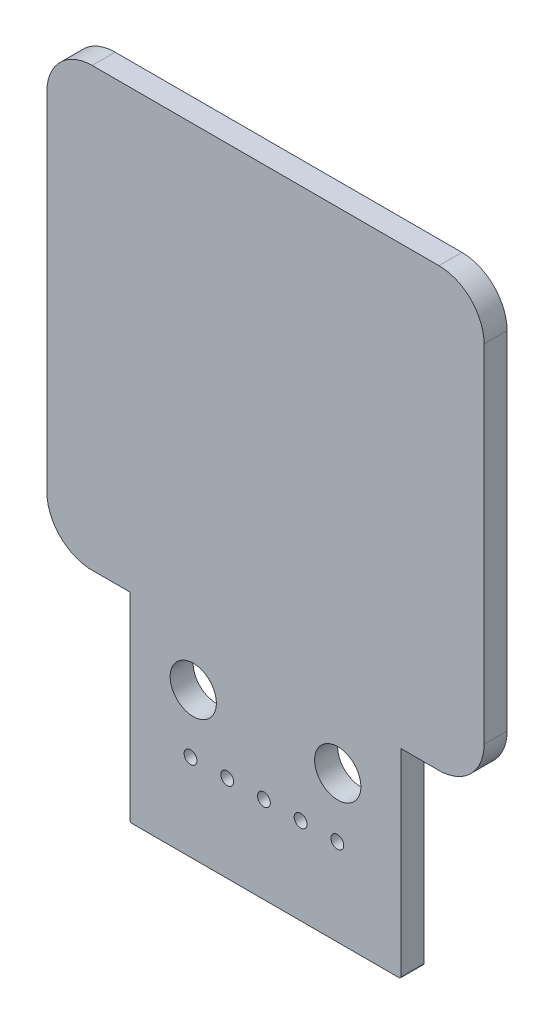
ISO-10303-21;
HEADER;
FILE_DESCRIPTION(('STEP AP214'),'2;1');
FILE_NAME('part.step','',(''),(''),'','','');
FILE_SCHEMA(('AUTOMOTIVE_DESIGN { 1 0 10303 214 1 1 1 1 }'));
ENDSEC;
DATA;
#1=APPLICATION_CONTEXT('core data for automotive mechanical design processes');
#2=APPLICATION_PROTOCOL_DEFINITION('international standard','automotive_design',2000,#1);
#3=PRODUCT_CONTEXT('',#1,'mechanical');
#4=PRODUCT('Part','Part','',(#3));
#5=PRODUCT_RELATED_PRODUCT_CATEGORY('part','',(#4));
#6=PRODUCT_DEFINITION_FORMATION('','',#4);
#7=PRODUCT_DEFINITION_CONTEXT('part definition',#1,'design');
#8=PRODUCT_DEFINITION('design','',#6,#7);
#9=PRODUCT_DEFINITION_SHAPE('','',#8);
#10=(LENGTH_UNIT() NAMED_UNIT(*) SI_UNIT(.MILLI.,.METRE.));
#11=(NAMED_UNIT(*) PLANE_ANGLE_UNIT() SI_UNIT($,.RADIAN.));
#12=(NAMED_UNIT(*) SI_UNIT($,.STERADIAN.) SOLID_ANGLE_UNIT());
#13=UNCERTAINTY_MEASURE_WITH_UNIT(LENGTH_MEASURE(1.E-05),#10,'distance_accuracy_value','');
#14=(GEOMETRIC_REPRESENTATION_CONTEXT(3) GLOBAL_UNCERTAINTY_ASSIGNED_CONTEXT((#13)) GLOBAL_UNIT_ASSIGNED_CONTEXT((#10,
#11,#12)) REPRESENTATION_CONTEXT('',''));
#15=CARTESIAN_POINT('',(0.,0.,0.));
#16=DIRECTION('',(0.,0.,1.));
#17=DIRECTION('',(1.,0.,0.));
#18=AXIS2_PLACEMENT_3D('',#15,#16,#17);
#19=CARTESIAN_POINT('',(28.438999176025,49.888000488281,1.59143954));
#20=DIRECTION('',(0.,0.,-1.));
#21=DIRECTION('',(0.,-1.,0.));
#22=AXIS2_PLACEMENT_3D('',#19,#20,#21);
#23=PLANE('',#22);
#24=CARTESIAN_POINT('',(45.74999994,46.19999904,1.59143954));
#25=DIRECTION('',(0.,0.,1.));
#26=DIRECTION('',(1.,0.,0.));
#27=AXIS2_PLACEMENT_3D('',#24,#25,#26);
#28=CIRCLE('',#27,1.59999934);
#29=CARTESIAN_POINT('',(47.34999928,46.19999904,1.59143954));
#30=VERTEX_POINT('',#29);
#31=EDGE_CURVE('E27',#30,#30,#28,.T.);
#32=ORIENTED_EDGE('',*,*,#31,.F.);
#33=EDGE_LOOP('',(#32));
#34=FACE_BOUND('',#33,.T.);
#35=CARTESIAN_POINT('',(45.72,42.07999966,1.59143954));
#36=DIRECTION('',(0.,0.,1.));
#37=DIRECTION('',(1.,0.,0.));
#38=AXIS2_PLACEMENT_3D('',#35,#36,#37);
#39=CIRCLE('',#38,0.4445);
#40=CARTESIAN_POINT('',(46.1645,42.07999966,1.59143954));
#41=VERTEX_POINT('',#40);
#42=EDGE_CURVE('E368',#41,#41,#39,.T.);
#43=ORIENTED_EDGE('',*,*,#42,.F.);
#44=EDGE_LOOP('',(#43));
#45=FACE_BOUND('',#44,.T.);
#46=CARTESIAN_POINT('',(43.18,42.07999966,1.59143954));
#47=DIRECTION('',(0.,0.,1.));
#48=DIRECTION('',(1.,0.,0.));
#49=AXIS2_PLACEMENT_3D('',#46,#47,#48);
#50=CIRCLE('',#49,0.4445);
#51=CARTESIAN_POINT('',(43.6245,42.07999966,1.59143954));
#52=VERTEX_POINT('',#51);
#53=EDGE_CURVE('E322',#52,#52,#50,.T.);
#54=ORIENTED_EDGE('',*,*,#53,.F.);
#55=EDGE_LOOP('',(#54));
#56=FACE_BOUND('',#55,.T.);
#57=CARTESIAN_POINT('',(40.64,42.07999966,1.59143954));
#58=DIRECTION('',(0.,0.,1.));
#59=DIRECTION('',(1.,0.,0.));
#60=AXIS2_PLACEMENT_3D('',#57,#58,#59);
#61=CIRCLE('',#60,0.4445);
#62=CARTESIAN_POINT('',(41.0845,42.07999966,1.59143954));
#63=VERTEX_POINT('',#62);
#64=EDGE_CURVE('E326',#63,#63,#61,.T.);
#65=ORIENTED_EDGE('',*,*,#64,.F.);
#66=EDGE_LOOP('',(#65));
#67=FACE_BOUND('',#66,.T.);
#68=CARTESIAN_POINT('',(35.74999962,46.19999904,1.59143954));
#69=DIRECTION('',(0.,0.,1.));
#70=DIRECTION('',(1.,0.,0.));
#71=AXIS2_PLACEMENT_3D('',#68,#69,#70);
#72=CIRCLE('',#71,1.59999934);
#73=CARTESIAN_POINT('',(37.34999896,46.19999904,1.59143954));
#74=VERTEX_POINT('',#73);
#75=EDGE_CURVE('E440',#74,#74,#72,.T.);
#76=ORIENTED_EDGE('',*,*,#75,.F.);
#77=EDGE_LOOP('',(#76));
#78=FACE_BOUND('',#77,.T.);
#79=CARTESIAN_POINT('',(35.56,42.07999966,1.59143954));
#80=DIRECTION('',(0.,0.,1.));
#81=DIRECTION('',(1.,0.,0.));
#82=AXIS2_PLACEMENT_3D('',#79,#80,#81);
#83=CIRCLE('',#82,0.4445);
#84=CARTESIAN_POINT('',(36.0045,42.07999966,1.59143954));
#85=VERTEX_POINT('',#84);
#86=EDGE_CURVE('E347',#85,#85,#83,.T.);
#87=ORIENTED_EDGE('',*,*,#86,.F.);
#88=EDGE_LOOP('',(#87));
#89=FACE_BOUND('',#88,.T.);
#90=CARTESIAN_POINT('',(38.1,42.07999966,1.59143954));
#91=DIRECTION('',(0.,0.,1.));
#92=DIRECTION('',(1.,0.,0.));
#93=AXIS2_PLACEMENT_3D('',#90,#91,#92);
#94=CIRCLE('',#93,0.4445);
#95=CARTESIAN_POINT('',(38.5445,42.07999966,1.59143954));
#96=VERTEX_POINT('',#95);
#97=EDGE_CURVE('E474',#96,#96,#94,.T.);
#98=ORIENTED_EDGE('',*,*,#97,.F.);
#99=EDGE_LOOP('',(#98));
#100=FACE_BOUND('',#99,.T.);
#101=CARTESIAN_POINT('',(28.502535775845,50.014855238936,1.59143954));
#102=DIRECTION('',(0.,0.,1.));
#103=DIRECTION('',(-0.447829373060854,-0.894119037166709,0.));
#104=AXIS2_PLACEMENT_3D('',#101,#102,#103);
#105=CIRCLE('',#104,0.141876803179);
#106=CARTESIAN_POINT('',(28.438999176025,49.888000488281,1.59143954));
#107=VERTEX_POINT('',#106);
#108=CARTESIAN_POINT('',(28.5,49.873001098633,1.59143954));
#109=VERTEX_POINT('',#108);
#110=EDGE_CURVE('E355',#107,#109,#105,.T.);
#111=ORIENTED_EDGE('',*,*,#110,.T.);
#112=DIRECTION('',(1.,0.,0.));
#113=VECTOR('',#112,1.);
#114=CARTESIAN_POINT('',(28.5,49.873001098633,1.59143954));
#115=LINE('',#114,#113);
#116=CARTESIAN_POINT('',(31.372999191284,49.873001098633,1.59143954));
#117=VERTEX_POINT('',#116);
#118=EDGE_CURVE('E283',#109,#117,#115,.T.);
#119=ORIENTED_EDGE('',*,*,#118,.T.);
#120=DIRECTION('',(0.,-1.,0.));
#121=VECTOR('',#120,1.);
#122=CARTESIAN_POINT('',(31.372999191284,49.873001098633,1.59143954));
#123=LINE('',#122,#121);
#124=CARTESIAN_POINT('',(31.372999191284,36.200000762939,1.59143954));
#125=VERTEX_POINT('',#124);
#126=EDGE_CURVE('E381',#117,#125,#123,.T.);
#127=ORIENTED_EDGE('',*,*,#126,.T.);
#128=CARTESIAN_POINT('',(31.499328380152,36.199331040368,1.59143954));
#129=DIRECTION('',(0.,0.,1.));
#130=DIRECTION('',(-0.999985947832841,0.00530133349769616,0.));
#131=AXIS2_PLACEMENT_3D('',#128,#129,#130);
#132=CIRCLE('',#131,0.126330964092);
#133=CARTESIAN_POINT('',(31.5,36.073001861572,1.59143954));
#134=VERTEX_POINT('',#133);
#135=EDGE_CURVE('E298',#125,#134,#132,.T.);
#136=ORIENTED_EDGE('',*,*,#135,.T.);
#137=DIRECTION('',(1.,0.,0.));
#138=VECTOR('',#137,1.);
#139=CARTESIAN_POINT('',(31.5,36.073001861572,1.59143954));
#140=LINE('',#139,#138);
#141=CARTESIAN_POINT('',(50.,36.073001861572,1.59143954));
#142=VERTEX_POINT('',#141);
#143=EDGE_CURVE('E458',#134,#142,#140,.T.);
#144=ORIENTED_EDGE('',*,*,#143,.T.);
#145=CARTESIAN_POINT('',(50.000672944282,36.199327818658,1.59143954));
#146=DIRECTION('',(0.,0.,1.));
#147=DIRECTION('',(-0.00532697118682877,-0.999985811588332,0.));
#148=AXIS2_PLACEMENT_3D('',#145,#146,#147);
#149=CIRCLE('',#148,0.126327749476);
#150=CARTESIAN_POINT('',(50.126998901367,36.200000762939,1.59143954));
#151=VERTEX_POINT('',#150);
#152=EDGE_CURVE('E296',#142,#151,#149,.T.);
#153=ORIENTED_EDGE('',*,*,#152,.T.);
#154=DIRECTION('',(0.,1.,0.));
#155=VECTOR('',#154,1.);
#156=CARTESIAN_POINT('',(50.126998901367,36.200000762939,1.59143954));
#157=LINE('',#156,#155);
#158=CARTESIAN_POINT('',(50.126998901367,49.873001098633,1.59143954));
#159=VERTEX_POINT('',#158);
#160=EDGE_CURVE('E364',#151,#159,#157,.T.);
#161=ORIENTED_EDGE('',*,*,#160,.T.);
#162=DIRECTION('',(1.,0.,0.));
#163=VECTOR('',#162,1.);
#164=CARTESIAN_POINT('',(50.126998901367,49.873001098633,1.59143954));
#165=LINE('',#164,#163);
#166=CARTESIAN_POINT('',(53.,49.873001098633,1.59143954));
#167=VERTEX_POINT('',#166);
#168=EDGE_CURVE('E258',#159,#167,#165,.T.);
#169=ORIENTED_EDGE('',*,*,#168,.T.);
#170=CARTESIAN_POINT('',(52.997459884636,50.014872887272,1.59143954));
#171=DIRECTION('',(0.,0.,1.));
#172=DIRECTION('',(0.017901433059204,-0.999839756508225,0.));
#173=AXIS2_PLACEMENT_3D('',#170,#171,#172);
#174=CIRCLE('',#173,0.141894526313);
#175=CARTESIAN_POINT('',(53.061000823975,49.888000488281,1.59143954));
#176=VERTEX_POINT('',#175);
#177=EDGE_CURVE('E255',#167,#176,#174,.T.);
#178=ORIENTED_EDGE('',*,*,#177,.T.);
#179=CARTESIAN_POINT('',(52.751520493602,52.998119575795,1.59143954));
#180=DIRECTION('',(0.,0.,1.));
#181=DIRECTION('',(0.0990185290008269,-0.99508558974317,0.));
#182=AXIS2_PLACEMENT_3D('',#179,#180,#181);
#183=CIRCLE('',#182,3.125478973438);
#184=CARTESIAN_POINT('',(55.876998901367,53.,1.59143954));
#185=VERTEX_POINT('',#184);
#186=EDGE_CURVE('E240',#176,#185,#183,.T.);
#187=ORIENTED_EDGE('',*,*,#186,.T.);
#188=DIRECTION('',(0.,1.,0.));
#189=VECTOR('',#188,1.);
#190=CARTESIAN_POINT('',(55.876998901367,53.,1.59143954));
#191=LINE('',#190,#189);
#192=CARTESIAN_POINT('',(55.876998901367,77.,1.59143954));
#193=VERTEX_POINT('',#192);
#194=EDGE_CURVE('E335',#185,#193,#191,.T.);
#195=ORIENTED_EDGE('',*,*,#194,.T.);
#196=CARTESIAN_POINT('',(52.749577959162,76.999577959162,1.59143954));
#197=DIRECTION('',(0.,0.,1.));
#198=DIRECTION('',(0.999999990894448,0.00013494852217636,0.));
#199=AXIS2_PLACEMENT_3D('',#196,#197,#198);
#200=CIRCLE('',#199,3.127420970682);
#201=CARTESIAN_POINT('',(52.75,80.126998901367,1.59143954));
#202=VERTEX_POINT('',#201);
#203=EDGE_CURVE('E340',#193,#202,#200,.T.);
#204=ORIENTED_EDGE('',*,*,#203,.T.);
#205=DIRECTION('',(-1.,0.,0.));
#206=VECTOR('',#205,1.);
#207=CARTESIAN_POINT('',(52.75,80.126998901367,1.59143954));
#208=LINE('',#207,#206);
#209=CARTESIAN_POINT('',(28.75,80.126998901367,1.59143954));
#210=VERTEX_POINT('',#209);
#211=EDGE_CURVE('E131',#202,#210,#208,.T.);
#212=ORIENTED_EDGE('',*,*,#211,.T.);
#213=CARTESIAN_POINT('',(28.750420133051,76.999577959343,1.59143954));
#214=DIRECTION('',(0.,0.,1.));
#215=DIRECTION('',(-0.000134338502895044,0.999999990976583,0.));
#216=AXIS2_PLACEMENT_3D('',#213,#214,#215);
#217=CIRCLE('',#216,3.127420970244);
#218=CARTESIAN_POINT('',(25.622999191284,77.,1.59143954));
#219=VERTEX_POINT('',#218);
#220=EDGE_CURVE('E308',#210,#219,#217,.T.);
#221=ORIENTED_EDGE('',*,*,#220,.T.);
#222=DIRECTION('',(0.,-1.,0.));
#223=VECTOR('',#222,1.);
#224=CARTESIAN_POINT('',(25.622999191284,77.,1.59143954));
#225=LINE('',#224,#223);
#226=CARTESIAN_POINT('',(25.622999191284,53.,1.59143954));
#227=VERTEX_POINT('',#226);
#228=EDGE_CURVE('E376',#219,#227,#225,.T.);
#229=ORIENTED_EDGE('',*,*,#228,.T.);
#230=CARTESIAN_POINT('',(28.748481284483,52.998123100366,1.59143954));
#231=DIRECTION('',(0.,0.,1.));
#232=DIRECTION('',(-0.999999819690771,0.000600515133193362,0.));
#233=AXIS2_PLACEMENT_3D('',#230,#231,#232);
#234=CIRCLE('',#233,3.125482656752);
#235=EDGE_CURVE('E284',#227,#107,#234,.T.);
#236=ORIENTED_EDGE('',*,*,#235,.T.);
#237=EDGE_LOOP('',(#111,#119,#127,#136,#144,#153,#161,#169,#178,#187,#195,#204,#212,#221,#229,#236));
#238=FACE_BOUND('',#237,.T.);
#239=ADVANCED_FACE('F16',(#34,#45,#56,#67,#78,#89,#100,#238),#23,.F.);
#240=CARTESIAN_POINT('',(28.438999176025,49.888000488281,0.));
#241=DIRECTION('',(0.,0.,-1.));
#242=DIRECTION('',(0.,-1.,0.));
#243=AXIS2_PLACEMENT_3D('',#240,#241,#242);
#244=PLANE('',#243);
#245=CARTESIAN_POINT('',(45.74999994,46.19999904,0.));
#246=DIRECTION('',(0.,0.,1.));
#247=DIRECTION('',(1.,0.,0.));
#248=AXIS2_PLACEMENT_3D('',#245,#246,#247);
#249=CIRCLE('',#248,1.59999934);
#250=CARTESIAN_POINT('',(47.34999928,46.19999904,0.));
#251=VERTEX_POINT('',#250);
#252=EDGE_CURVE('E11',#251,#251,#249,.T.);
#253=ORIENTED_EDGE('',*,*,#252,.T.);
#254=EDGE_LOOP('',(#253));
#255=FACE_BOUND('',#254,.T.);
#256=CARTESIAN_POINT('',(45.72,42.07999966,0.));
#257=DIRECTION('',(0.,0.,1.));
#258=DIRECTION('',(1.,0.,0.));
#259=AXIS2_PLACEMENT_3D('',#256,#257,#258);
#260=CIRCLE('',#259,0.4445);
#261=CARTESIAN_POINT('',(46.1645,42.07999966,0.));
#262=VERTEX_POINT('',#261);
#263=EDGE_CURVE('E427',#262,#262,#260,.T.);
#264=ORIENTED_EDGE('',*,*,#263,.T.);
#265=EDGE_LOOP('',(#264));
#266=FACE_BOUND('',#265,.T.);
#267=CARTESIAN_POINT('',(43.18,42.07999966,0.));
#268=DIRECTION('',(0.,0.,1.));
#269=DIRECTION('',(1.,0.,0.));
#270=AXIS2_PLACEMENT_3D('',#267,#268,#269);
#271=CIRCLE('',#270,0.4445);
#272=CARTESIAN_POINT('',(43.6245,42.07999966,0.));
#273=VERTEX_POINT('',#272);
#274=EDGE_CURVE('E318',#273,#273,#271,.T.);
#275=ORIENTED_EDGE('',*,*,#274,.T.);
#276=EDGE_LOOP('',(#275));
#277=FACE_BOUND('',#276,.T.);
#278=CARTESIAN_POINT('',(40.64,42.07999966,0.));
#279=DIRECTION('',(0.,0.,1.));
#280=DIRECTION('',(1.,0.,0.));
#281=AXIS2_PLACEMENT_3D('',#278,#279,#280);
#282=CIRCLE('',#281,0.4445);
#283=CARTESIAN_POINT('',(41.0845,42.07999966,0.));
#284=VERTEX_POINT('',#283);
#285=EDGE_CURVE('E437',#284,#284,#282,.T.);
#286=ORIENTED_EDGE('',*,*,#285,.T.);
#287=EDGE_LOOP('',(#286));
#288=FACE_BOUND('',#287,.T.);
#289=CARTESIAN_POINT('',(35.74999962,46.19999904,0.));
#290=DIRECTION('',(0.,0.,1.));
#291=DIRECTION('',(1.,0.,0.));
#292=AXIS2_PLACEMENT_3D('',#289,#290,#291);
#293=CIRCLE('',#292,1.59999934);
#294=CARTESIAN_POINT('',(37.34999896,46.19999904,0.));
#295=VERTEX_POINT('',#294);
#296=EDGE_CURVE('E327',#295,#295,#293,.T.);
#297=ORIENTED_EDGE('',*,*,#296,.T.);
#298=EDGE_LOOP('',(#297));
#299=FACE_BOUND('',#298,.T.);
#300=CARTESIAN_POINT('',(35.56,42.07999966,0.));
#301=DIRECTION('',(0.,0.,1.));
#302=DIRECTION('',(1.,0.,0.));
#303=AXIS2_PLACEMENT_3D('',#300,#301,#302);
#304=CIRCLE('',#303,0.4445);
#305=CARTESIAN_POINT('',(36.0045,42.07999966,0.));
#306=VERTEX_POINT('',#305);
#307=EDGE_CURVE('E350',#306,#306,#304,.T.);
#308=ORIENTED_EDGE('',*,*,#307,.T.);
#309=EDGE_LOOP('',(#308));
#310=FACE_BOUND('',#309,.T.);
#311=CARTESIAN_POINT('',(38.1,42.07999966,0.));
#312=DIRECTION('',(0.,0.,1.));
#313=DIRECTION('',(1.,0.,0.));
#314=AXIS2_PLACEMENT_3D('',#311,#312,#313);
#315=CIRCLE('',#314,0.4445);
#316=CARTESIAN_POINT('',(38.5445,42.07999966,0.));
#317=VERTEX_POINT('',#316);
#318=EDGE_CURVE('E477',#317,#317,#315,.T.);
#319=ORIENTED_EDGE('',*,*,#318,.T.);
#320=EDGE_LOOP('',(#319));
#321=FACE_BOUND('',#320,.T.);
#322=CARTESIAN_POINT('',(28.748481284483,52.998123100366,0.));
#323=DIRECTION('',(0.,0.,1.));
#324=DIRECTION('',(-0.999999819690771,0.000600515133193362,0.));
#325=AXIS2_PLACEMENT_3D('',#322,#323,#324);
#326=CIRCLE('',#325,3.125482656752);
#327=CARTESIAN_POINT('',(25.622999191284,53.,0.));
#328=VERTEX_POINT('',#327);
#329=CARTESIAN_POINT('',(28.438999176025,49.888000488281,0.));
#330=VERTEX_POINT('',#329);
#331=EDGE_CURVE('E190',#328,#330,#326,.T.);
#332=ORIENTED_EDGE('',*,*,#331,.F.);
#333=DIRECTION('',(0.,-1.,0.));
#334=VECTOR('',#333,1.);
#335=CARTESIAN_POINT('',(25.622999191284,77.,0.));
#336=LINE('',#335,#334);
#337=CARTESIAN_POINT('',(25.622999191284,77.,0.));
#338=VERTEX_POINT('',#337);
#339=EDGE_CURVE('E304',#338,#328,#336,.T.);
#340=ORIENTED_EDGE('',*,*,#339,.F.);
#341=CARTESIAN_POINT('',(28.750420133051,76.999577959343,0.));
#342=DIRECTION('',(0.,0.,1.));
#343=DIRECTION('',(-0.000134338502895044,0.999999990976583,0.));
#344=AXIS2_PLACEMENT_3D('',#341,#342,#343);
#345=CIRCLE('',#344,3.127420970244);
#346=CARTESIAN_POINT('',(28.75,80.126998901367,0.));
#347=VERTEX_POINT('',#346);
#348=EDGE_CURVE('E287',#347,#338,#345,.T.);
#349=ORIENTED_EDGE('',*,*,#348,.F.);
#350=DIRECTION('',(-1.,0.,0.));
#351=VECTOR('',#350,1.);
#352=CARTESIAN_POINT('',(52.75,80.126998901367,0.));
#353=LINE('',#352,#351);
#354=CARTESIAN_POINT('',(52.75,80.126998901367,0.));
#355=VERTEX_POINT('',#354);
#356=EDGE_CURVE('E146',#355,#347,#353,.T.);
#357=ORIENTED_EDGE('',*,*,#356,.F.);
#358=CARTESIAN_POINT('',(52.749577959162,76.999577959162,0.));
#359=DIRECTION('',(0.,0.,1.));
#360=DIRECTION('',(0.999999990894448,0.00013494852217636,0.));
#361=AXIS2_PLACEMENT_3D('',#358,#359,#360);
#362=CIRCLE('',#361,3.127420970682);
#363=CARTESIAN_POINT('',(55.876998901367,77.,0.));
#364=VERTEX_POINT('',#363);
#365=EDGE_CURVE('E446',#364,#355,#362,.T.);
#366=ORIENTED_EDGE('',*,*,#365,.F.);
#367=DIRECTION('',(0.,1.,0.));
#368=VECTOR('',#367,1.);
#369=CARTESIAN_POINT('',(55.876998901367,53.,0.));
#370=LINE('',#369,#368);
#371=CARTESIAN_POINT('',(55.876998901367,53.,0.));
#372=VERTEX_POINT('',#371);
#373=EDGE_CURVE('E252',#372,#364,#370,.T.);
#374=ORIENTED_EDGE('',*,*,#373,.F.);
#375=CARTESIAN_POINT('',(52.751520493602,52.998119575795,0.));
#376=DIRECTION('',(0.,0.,1.));
#377=DIRECTION('',(0.0990185290008269,-0.99508558974317,0.));
#378=AXIS2_PLACEMENT_3D('',#375,#376,#377);
#379=CIRCLE('',#378,3.125478973438);
#380=CARTESIAN_POINT('',(53.061000823975,49.888000488281,0.));
#381=VERTEX_POINT('',#380);
#382=EDGE_CURVE('E263',#381,#372,#379,.T.);
#383=ORIENTED_EDGE('',*,*,#382,.F.);
#384=CARTESIAN_POINT('',(52.997459884636,50.014872887272,0.));
#385=DIRECTION('',(0.,0.,1.));
#386=DIRECTION('',(0.017901433059204,-0.999839756508225,0.));
#387=AXIS2_PLACEMENT_3D('',#384,#385,#386);
#388=CIRCLE('',#387,0.141894526313);
#389=CARTESIAN_POINT('',(53.,49.873001098633,0.));
#390=VERTEX_POINT('',#389);
#391=EDGE_CURVE('E266',#390,#381,#388,.T.);
#392=ORIENTED_EDGE('',*,*,#391,.F.);
#393=DIRECTION('',(1.,0.,0.));
#394=VECTOR('',#393,1.);
#395=CARTESIAN_POINT('',(50.126998901367,49.873001098633,0.));
#396=LINE('',#395,#394);
#397=CARTESIAN_POINT('',(50.126998901367,49.873001098633,0.));
#398=VERTEX_POINT('',#397);
#399=EDGE_CURVE('E317',#398,#390,#396,.T.);
#400=ORIENTED_EDGE('',*,*,#399,.F.);
#401=DIRECTION('',(0.,1.,0.));
#402=VECTOR('',#401,1.);
#403=CARTESIAN_POINT('',(50.126998901367,36.200000762939,0.));
#404=LINE('',#403,#402);
#405=CARTESIAN_POINT('',(50.126998901367,36.200000762939,0.));
#406=VERTEX_POINT('',#405);
#407=EDGE_CURVE('E313',#406,#398,#404,.T.);
#408=ORIENTED_EDGE('',*,*,#407,.F.);
#409=CARTESIAN_POINT('',(50.000672944282,36.199327818658,0.));
#410=DIRECTION('',(0.,0.,1.));
#411=DIRECTION('',(-0.00532697118682877,-0.999985811588332,0.));
#412=AXIS2_PLACEMENT_3D('',#409,#410,#411);
#413=CIRCLE('',#412,0.126327749476);
#414=CARTESIAN_POINT('',(50.,36.073001861572,0.));
#415=VERTEX_POINT('',#414);
#416=EDGE_CURVE('E297',#415,#406,#413,.T.);
#417=ORIENTED_EDGE('',*,*,#416,.F.);
#418=DIRECTION('',(1.,0.,0.));
#419=VECTOR('',#418,1.);
#420=CARTESIAN_POINT('',(31.5,36.073001861572,0.));
#421=LINE('',#420,#419);
#422=CARTESIAN_POINT('',(31.5,36.073001861572,0.));
#423=VERTEX_POINT('',#422);
#424=EDGE_CURVE('E302',#423,#415,#421,.T.);
#425=ORIENTED_EDGE('',*,*,#424,.F.);
#426=CARTESIAN_POINT('',(31.499328380152,36.199331040368,0.));
#427=DIRECTION('',(0.,0.,1.));
#428=DIRECTION('',(-0.999985947832841,0.00530133349769616,0.));
#429=AXIS2_PLACEMENT_3D('',#426,#427,#428);
#430=CIRCLE('',#429,0.126330964092);
#431=CARTESIAN_POINT('',(31.372999191284,36.200000762939,0.));
#432=VERTEX_POINT('',#431);
#433=EDGE_CURVE('E378',#432,#423,#430,.T.);
#434=ORIENTED_EDGE('',*,*,#433,.F.);
#435=DIRECTION('',(0.,-1.,0.));
#436=VECTOR('',#435,1.);
#437=CARTESIAN_POINT('',(31.372999191284,49.873001098633,0.));
#438=LINE('',#437,#436);
#439=CARTESIAN_POINT('',(31.372999191284,49.873001098633,0.));
#440=VERTEX_POINT('',#439);
#441=EDGE_CURVE('E278',#440,#432,#438,.T.);
#442=ORIENTED_EDGE('',*,*,#441,.F.);
#443=DIRECTION('',(1.,0.,0.));
#444=VECTOR('',#443,1.);
#445=CARTESIAN_POINT('',(28.5,49.873001098633,0.));
#446=LINE('',#445,#444);
#447=CARTESIAN_POINT('',(28.5,49.873001098633,0.));
#448=VERTEX_POINT('',#447);
#449=EDGE_CURVE('E179',#448,#440,#446,.T.);
#450=ORIENTED_EDGE('',*,*,#449,.F.);
#451=CARTESIAN_POINT('',(28.502535775845,50.014855238936,0.));
#452=DIRECTION('',(0.,0.,1.));
#453=DIRECTION('',(-0.447829373060854,-0.894119037166709,0.));
#454=AXIS2_PLACEMENT_3D('',#451,#452,#453);
#455=CIRCLE('',#454,0.141876803179);
#456=EDGE_CURVE('E356',#330,#448,#455,.T.);
#457=ORIENTED_EDGE('',*,*,#456,.F.);
#458=EDGE_LOOP('',(#332,#340,#349,#357,#366,#374,#383,#392,#400,#408,#417,#425,#434,#442,#450,#457));
#459=FACE_BOUND('',#458,.T.);
#460=ADVANCED_FACE('F18',(#255,#266,#277,#288,#299,#310,#321,#459),#244,.T.);
#461=CARTESIAN_POINT('',(45.74999994,46.19999904,0.));
#462=DIRECTION('',(0.,0.,-1.));
#463=DIRECTION('',(1.,0.,0.));
#464=AXIS2_PLACEMENT_3D('',#461,#462,#463);
#465=CYLINDRICAL_SURFACE('',#464,1.59999934);
#466=DIRECTION('',(0.,0.,1.));
#467=VECTOR('',#466,1.);
#468=CARTESIAN_POINT('',(47.34999928,46.19999904,0.));
#469=LINE('',#468,#467);
#470=EDGE_CURVE('E418',#251,#30,#469,.T.);
#471=ORIENTED_EDGE('',*,*,#470,.T.);
#472=ORIENTED_EDGE('',*,*,#31,.T.);
#473=ORIENTED_EDGE('',*,*,#470,.F.);
#474=ORIENTED_EDGE('',*,*,#252,.F.);
#475=EDGE_LOOP('',(#471,#472,#473,#474));
#476=FACE_BOUND('',#475,.T.);
#477=ADVANCED_FACE('F497',(#476),#465,.F.);
#478=CARTESIAN_POINT('',(45.72,42.07999966,0.));
#479=DIRECTION('',(0.,0.,-1.));
#480=DIRECTION('',(1.,0.,0.));
#481=AXIS2_PLACEMENT_3D('',#478,#479,#480);
#482=CYLINDRICAL_SURFACE('',#481,0.4445);
#483=DIRECTION('',(0.,0.,1.));
#484=VECTOR('',#483,1.);
#485=CARTESIAN_POINT('',(46.1645,42.07999966,0.));
#486=LINE('',#485,#484);
#487=EDGE_CURVE('E321',#262,#41,#486,.T.);
#488=ORIENTED_EDGE('',*,*,#487,.T.);
#489=ORIENTED_EDGE('',*,*,#42,.T.);
#490=ORIENTED_EDGE('',*,*,#487,.F.);
#491=ORIENTED_EDGE('',*,*,#263,.F.);
#492=EDGE_LOOP('',(#488,#489,#490,#491));
#493=FACE_BOUND('',#492,.T.);
#494=ADVANCED_FACE('F762',(#493),#482,.F.);
#495=CARTESIAN_POINT('',(43.18,42.07999966,0.));
#496=DIRECTION('',(0.,0.,-1.));
#497=DIRECTION('',(1.,0.,0.));
#498=AXIS2_PLACEMENT_3D('',#495,#496,#497);
#499=CYLINDRICAL_SURFACE('',#498,0.4445);
#500=DIRECTION('',(0.,0.,1.));
#501=VECTOR('',#500,1.);
#502=CARTESIAN_POINT('',(43.6245,42.07999966,0.));
#503=LINE('',#502,#501);
#504=EDGE_CURVE('E433',#273,#52,#503,.T.);
#505=ORIENTED_EDGE('',*,*,#504,.T.);
#506=ORIENTED_EDGE('',*,*,#53,.T.);
#507=ORIENTED_EDGE('',*,*,#504,.F.);
#508=ORIENTED_EDGE('',*,*,#274,.F.);
#509=EDGE_LOOP('',(#505,#506,#507,#508));
#510=FACE_BOUND('',#509,.T.);
#511=ADVANCED_FACE('F651',(#510),#499,.F.);
#512=CARTESIAN_POINT('',(40.64,42.07999966,0.));
#513=DIRECTION('',(0.,0.,-1.));
#514=DIRECTION('',(1.,0.,0.));
#515=AXIS2_PLACEMENT_3D('',#512,#513,#514);
#516=CYLINDRICAL_SURFACE('',#515,0.4445);
#517=DIRECTION('',(0.,0.,1.));
#518=VECTOR('',#517,1.);
#519=CARTESIAN_POINT('',(41.0845,42.07999966,0.));
#520=LINE('',#519,#518);
#521=EDGE_CURVE('E323',#284,#63,#520,.T.);
#522=ORIENTED_EDGE('',*,*,#521,.T.);
#523=ORIENTED_EDGE('',*,*,#64,.T.);
#524=ORIENTED_EDGE('',*,*,#521,.F.);
#525=ORIENTED_EDGE('',*,*,#285,.F.);
#526=EDGE_LOOP('',(#522,#523,#524,#525));
#527=FACE_BOUND('',#526,.T.);
#528=ADVANCED_FACE('F641',(#527),#516,.F.);
#529=CARTESIAN_POINT('',(35.74999962,46.19999904,0.));
#530=DIRECTION('',(0.,0.,-1.));
#531=DIRECTION('',(1.,0.,0.));
#532=AXIS2_PLACEMENT_3D('',#529,#530,#531);
#533=CYLINDRICAL_SURFACE('',#532,1.59999934);
#534=DIRECTION('',(0.,0.,1.));
#535=VECTOR('',#534,1.);
#536=CARTESIAN_POINT('',(37.34999896,46.19999904,0.));
#537=LINE('',#536,#535);
#538=EDGE_CURVE('E444',#295,#74,#537,.T.);
#539=ORIENTED_EDGE('',*,*,#538,.T.);
#540=ORIENTED_EDGE('',*,*,#75,.T.);
#541=ORIENTED_EDGE('',*,*,#538,.F.);
#542=ORIENTED_EDGE('',*,*,#296,.F.);
#543=EDGE_LOOP('',(#539,#540,#541,#542));
#544=FACE_BOUND('',#543,.T.);
#545=ADVANCED_FACE('F636',(#544),#533,.F.);
#546=CARTESIAN_POINT('',(35.56,42.07999966,0.));
#547=DIRECTION('',(0.,0.,-1.));
#548=DIRECTION('',(1.,0.,0.));
#549=AXIS2_PLACEMENT_3D('',#546,#547,#548);
#550=CYLINDRICAL_SURFACE('',#549,0.4445);
#551=DIRECTION('',(0.,0.,1.));
#552=VECTOR('',#551,1.);
#553=CARTESIAN_POINT('',(36.0045,42.07999966,0.));
#554=LINE('',#553,#552);
#555=EDGE_CURVE('E20',#306,#85,#554,.T.);
#556=ORIENTED_EDGE('',*,*,#555,.T.);
#557=ORIENTED_EDGE('',*,*,#86,.T.);
#558=ORIENTED_EDGE('',*,*,#555,.F.);
#559=ORIENTED_EDGE('',*,*,#307,.F.);
#560=EDGE_LOOP('',(#556,#557,#558,#559));
#561=FACE_BOUND('',#560,.T.);
#562=ADVANCED_FACE('F493',(#561),#550,.F.);
#563=CARTESIAN_POINT('',(38.1,42.07999966,0.));
#564=DIRECTION('',(0.,0.,-1.));
#565=DIRECTION('',(1.,0.,0.));
#566=AXIS2_PLACEMENT_3D('',#563,#564,#565);
#567=CYLINDRICAL_SURFACE('',#566,0.4445);
#568=DIRECTION('',(0.,0.,1.));
#569=VECTOR('',#568,1.);
#570=CARTESIAN_POINT('',(38.5445,42.07999966,0.));
#571=LINE('',#570,#569);
#572=EDGE_CURVE('E276',#317,#96,#571,.T.);
#573=ORIENTED_EDGE('',*,*,#572,.T.);
#574=ORIENTED_EDGE('',*,*,#97,.T.);
#575=ORIENTED_EDGE('',*,*,#572,.F.);
#576=ORIENTED_EDGE('',*,*,#318,.F.);
#577=EDGE_LOOP('',(#573,#574,#575,#576));
#578=FACE_BOUND('',#577,.T.);
#579=ADVANCED_FACE('F715',(#578),#567,.F.);
#580=CARTESIAN_POINT('',(28.748481284483,52.998123100366,0.));
#581=DIRECTION('',(0.,0.,-1.));
#582=DIRECTION('',(-0.999999819690771,0.000600515133193362,0.));
#583=AXIS2_PLACEMENT_3D('',#580,#581,#582);
#584=CYLINDRICAL_SURFACE('',#583,3.125482656752);
#585=ORIENTED_EDGE('',*,*,#331,.T.);
#586=DIRECTION('',(0.,0.,1.));
#587=VECTOR('',#586,1.);
#588=CARTESIAN_POINT('',(28.438999176025,49.888000488281,0.));
#589=LINE('',#588,#587);
#590=EDGE_CURVE('E400',#330,#107,#589,.T.);
#591=ORIENTED_EDGE('',*,*,#590,.T.);
#592=ORIENTED_EDGE('',*,*,#235,.F.);
#593=DIRECTION('',(0.,0.,1.));
#594=VECTOR('',#593,1.);
#595=CARTESIAN_POINT('',(25.622999191284,53.,0.));
#596=LINE('',#595,#594);
#597=EDGE_CURVE('E307',#328,#227,#596,.T.);
#598=ORIENTED_EDGE('',*,*,#597,.F.);
#599=EDGE_LOOP('',(#585,#591,#592,#598));
#600=FACE_BOUND('',#599,.T.);
#601=ADVANCED_FACE('F500',(#600),#584,.T.);
#602=CARTESIAN_POINT('',(25.622999191284,77.,0.));
#603=DIRECTION('',(1.,0.,0.));
#604=DIRECTION('',(0.,1.,0.));
#605=AXIS2_PLACEMENT_3D('',#602,#603,#604);
#606=PLANE('',#605);
#607=ORIENTED_EDGE('',*,*,#339,.T.);
#608=ORIENTED_EDGE('',*,*,#597,.T.);
#609=ORIENTED_EDGE('',*,*,#228,.F.);
#610=DIRECTION('',(0.,0.,1.));
#611=VECTOR('',#610,1.);
#612=CARTESIAN_POINT('',(25.622999191284,77.,0.));
#613=LINE('',#612,#611);
#614=EDGE_CURVE('E291',#338,#219,#613,.T.);
#615=ORIENTED_EDGE('',*,*,#614,.F.);
#616=EDGE_LOOP('',(#607,#608,#609,#615));
#617=FACE_BOUND('',#616,.T.);
#618=ADVANCED_FACE('F503',(#617),#606,.F.);
#619=CARTESIAN_POINT('',(28.750420133051,76.999577959343,0.));
#620=DIRECTION('',(0.,0.,-1.));
#621=DIRECTION('',(-0.000134338502895044,0.999999990976583,0.));
#622=AXIS2_PLACEMENT_3D('',#619,#620,#621);
#623=CYLINDRICAL_SURFACE('',#622,3.127420970244);
#624=ORIENTED_EDGE('',*,*,#348,.T.);
#625=ORIENTED_EDGE('',*,*,#614,.T.);
#626=ORIENTED_EDGE('',*,*,#220,.F.);
#627=DIRECTION('',(0.,0.,1.));
#628=VECTOR('',#627,1.);
#629=CARTESIAN_POINT('',(28.75,80.126998901367,0.));
#630=LINE('',#629,#628);
#631=EDGE_CURVE('E359',#347,#210,#630,.T.);
#632=ORIENTED_EDGE('',*,*,#631,.F.);
#633=EDGE_LOOP('',(#624,#625,#626,#632));
#634=FACE_BOUND('',#633,.T.);
#635=ADVANCED_FACE('F509',(#634),#623,.T.);
#636=CARTESIAN_POINT('',(52.75,80.126998901367,0.));
#637=DIRECTION('',(0.,-1.,0.));
#638=DIRECTION('',(0.,0.,-1.));
#639=AXIS2_PLACEMENT_3D('',#636,#637,#638);
#640=PLANE('',#639);
#641=ORIENTED_EDGE('',*,*,#356,.T.);
#642=ORIENTED_EDGE('',*,*,#631,.T.);
#643=ORIENTED_EDGE('',*,*,#211,.F.);
#644=DIRECTION('',(0.,0.,1.));
#645=VECTOR('',#644,1.);
#646=CARTESIAN_POINT('',(52.75,80.126998901367,0.));
#647=LINE('',#646,#645);
#648=EDGE_CURVE('E343',#355,#202,#647,.T.);
#649=ORIENTED_EDGE('',*,*,#648,.F.);
#650=EDGE_LOOP('',(#641,#642,#643,#649));
#651=FACE_BOUND('',#650,.T.);
#652=ADVANCED_FACE('F511',(#651),#640,.F.);
#653=CARTESIAN_POINT('',(52.749577959162,76.999577959162,0.));
#654=DIRECTION('',(0.,0.,-1.));
#655=DIRECTION('',(0.999999990894448,0.00013494852217636,0.));
#656=AXIS2_PLACEMENT_3D('',#653,#654,#655);
#657=CYLINDRICAL_SURFACE('',#656,3.127420970682);
#658=ORIENTED_EDGE('',*,*,#365,.T.);
#659=ORIENTED_EDGE('',*,*,#648,.T.);
#660=ORIENTED_EDGE('',*,*,#203,.F.);
#661=DIRECTION('',(0.,0.,1.));
#662=VECTOR('',#661,1.);
#663=CARTESIAN_POINT('',(55.876998901367,77.,0.));
#664=LINE('',#663,#662);
#665=EDGE_CURVE('E331',#364,#193,#664,.T.);
#666=ORIENTED_EDGE('',*,*,#665,.F.);
#667=EDGE_LOOP('',(#658,#659,#660,#666));
#668=FACE_BOUND('',#667,.T.);
#669=ADVANCED_FACE('F629',(#668),#657,.T.);
#670=CARTESIAN_POINT('',(55.876998901367,53.,0.));
#671=DIRECTION('',(-1.,0.,0.));
#672=DIRECTION('',(0.,0.,1.));
#673=AXIS2_PLACEMENT_3D('',#670,#671,#672);
#674=PLANE('',#673);
#675=ORIENTED_EDGE('',*,*,#373,.T.);
#676=ORIENTED_EDGE('',*,*,#665,.T.);
#677=ORIENTED_EDGE('',*,*,#194,.F.);
#678=DIRECTION('',(0.,0.,1.));
#679=VECTOR('',#678,1.);
#680=CARTESIAN_POINT('',(55.876998901367,53.,0.));
#681=LINE('',#680,#679);
#682=EDGE_CURVE('E248',#372,#185,#681,.T.);
#683=ORIENTED_EDGE('',*,*,#682,.F.);
#684=EDGE_LOOP('',(#675,#676,#677,#683));
#685=FACE_BOUND('',#684,.T.);
#686=ADVANCED_FACE('F624',(#685),#674,.F.);
#687=CARTESIAN_POINT('',(52.751520493602,52.998119575795,0.));
#688=DIRECTION('',(0.,0.,-1.));
#689=DIRECTION('',(0.0990185290008269,-0.99508558974317,0.));
#690=AXIS2_PLACEMENT_3D('',#687,#688,#689);
#691=CYLINDRICAL_SURFACE('',#690,3.125478973438);
#692=ORIENTED_EDGE('',*,*,#382,.T.);
#693=ORIENTED_EDGE('',*,*,#682,.T.);
#694=ORIENTED_EDGE('',*,*,#186,.F.);
#695=DIRECTION('',(0.,0.,1.));
#696=VECTOR('',#695,1.);
#697=CARTESIAN_POINT('',(53.061000823975,49.888000488281,0.));
#698=LINE('',#697,#696);
#699=EDGE_CURVE('E245',#381,#176,#698,.T.);
#700=ORIENTED_EDGE('',*,*,#699,.F.);
#701=EDGE_LOOP('',(#692,#693,#694,#700));
#702=FACE_BOUND('',#701,.T.);
#703=ADVANCED_FACE('F243',(#702),#691,.T.);
#704=CARTESIAN_POINT('',(52.997459884636,50.014872887272,0.));
#705=DIRECTION('',(0.,0.,-1.));
#706=DIRECTION('',(0.017901433059204,-0.999839756508225,0.));
#707=AXIS2_PLACEMENT_3D('',#704,#705,#706);
#708=CYLINDRICAL_SURFACE('',#707,0.141894526313);
#709=ORIENTED_EDGE('',*,*,#391,.T.);
#710=ORIENTED_EDGE('',*,*,#699,.T.);
#711=ORIENTED_EDGE('',*,*,#177,.F.);
#712=DIRECTION('',(0.,0.,1.));
#713=VECTOR('',#712,1.);
#714=CARTESIAN_POINT('',(53.,49.873001098633,0.));
#715=LINE('',#714,#713);
#716=EDGE_CURVE('E314',#390,#167,#715,.T.);
#717=ORIENTED_EDGE('',*,*,#716,.F.);
#718=EDGE_LOOP('',(#709,#710,#711,#717));
#719=FACE_BOUND('',#718,.T.);
#720=ADVANCED_FACE('F265',(#719),#708,.T.);
#721=CARTESIAN_POINT('',(50.126998901367,49.873001098633,0.));
#722=DIRECTION('',(0.,1.,0.));
#723=DIRECTION('',(1.,0.,0.));
#724=AXIS2_PLACEMENT_3D('',#721,#722,#723);
#725=PLANE('',#724);
#726=ORIENTED_EDGE('',*,*,#399,.T.);
#727=ORIENTED_EDGE('',*,*,#716,.T.);
#728=ORIENTED_EDGE('',*,*,#168,.F.);
#729=DIRECTION('',(0.,0.,1.));
#730=VECTOR('',#729,1.);
#731=CARTESIAN_POINT('',(50.126998901367,49.873001098633,0.));
#732=LINE('',#731,#730);
#733=EDGE_CURVE('E360',#398,#159,#732,.T.);
#734=ORIENTED_EDGE('',*,*,#733,.F.);
#735=EDGE_LOOP('',(#726,#727,#728,#734));
#736=FACE_BOUND('',#735,.T.);
#737=ADVANCED_FACE('F675',(#736),#725,.F.);
#738=CARTESIAN_POINT('',(50.126998901367,36.200000762939,0.));
#739=DIRECTION('',(-1.,0.,0.));
#740=DIRECTION('',(0.,0.,1.));
#741=AXIS2_PLACEMENT_3D('',#738,#739,#740);
#742=PLANE('',#741);
#743=ORIENTED_EDGE('',*,*,#407,.T.);
#744=ORIENTED_EDGE('',*,*,#733,.T.);
#745=ORIENTED_EDGE('',*,*,#160,.F.);
#746=DIRECTION('',(0.,0.,1.));
#747=VECTOR('',#746,1.);
#748=CARTESIAN_POINT('',(50.126998901367,36.200000762939,0.));
#749=LINE('',#748,#747);
#750=EDGE_CURVE('E292',#406,#151,#749,.T.);
#751=ORIENTED_EDGE('',*,*,#750,.F.);
#752=EDGE_LOOP('',(#743,#744,#745,#751));
#753=FACE_BOUND('',#752,.T.);
#754=ADVANCED_FACE('F669',(#753),#742,.F.);
#755=CARTESIAN_POINT('',(50.000672944282,36.199327818658,0.));
#756=DIRECTION('',(0.,0.,-1.));
#757=DIRECTION('',(-0.00532697118682877,-0.999985811588332,0.));
#758=AXIS2_PLACEMENT_3D('',#755,#756,#757);
#759=CYLINDRICAL_SURFACE('',#758,0.126327749476);
#760=ORIENTED_EDGE('',*,*,#416,.T.);
#761=ORIENTED_EDGE('',*,*,#750,.T.);
#762=ORIENTED_EDGE('',*,*,#152,.F.);
#763=DIRECTION('',(0.,0.,1.));
#764=VECTOR('',#763,1.);
#765=CARTESIAN_POINT('',(50.,36.073001861572,0.));
#766=LINE('',#765,#764);
#767=EDGE_CURVE('E372',#415,#142,#766,.T.);
#768=ORIENTED_EDGE('',*,*,#767,.F.);
#769=EDGE_LOOP('',(#760,#761,#762,#768));
#770=FACE_BOUND('',#769,.T.);
#771=ADVANCED_FACE('F674',(#770),#759,.T.);
#772=CARTESIAN_POINT('',(31.5,36.073001861572,0.));
#773=DIRECTION('',(0.,1.,0.));
#774=DIRECTION('',(1.,0.,0.));
#775=AXIS2_PLACEMENT_3D('',#772,#773,#774);
#776=PLANE('',#775);
#777=ORIENTED_EDGE('',*,*,#424,.T.);
#778=ORIENTED_EDGE('',*,*,#767,.T.);
#779=ORIENTED_EDGE('',*,*,#143,.F.);
#780=DIRECTION('',(0.,0.,1.));
#781=VECTOR('',#780,1.);
#782=CARTESIAN_POINT('',(31.5,36.073001861572,0.));
#783=LINE('',#782,#781);
#784=EDGE_CURVE('E303',#423,#134,#783,.T.);
#785=ORIENTED_EDGE('',*,*,#784,.F.);
#786=EDGE_LOOP('',(#777,#778,#779,#785));
#787=FACE_BOUND('',#786,.T.);
#788=ADVANCED_FACE('F663',(#787),#776,.F.);
#789=CARTESIAN_POINT('',(31.499328380152,36.199331040368,0.));
#790=DIRECTION('',(0.,0.,-1.));
#791=DIRECTION('',(-0.999985947832841,0.00530133349769616,0.));
#792=AXIS2_PLACEMENT_3D('',#789,#790,#791);
#793=CYLINDRICAL_SURFACE('',#792,0.126330964092);
#794=ORIENTED_EDGE('',*,*,#433,.T.);
#795=ORIENTED_EDGE('',*,*,#784,.T.);
#796=ORIENTED_EDGE('',*,*,#135,.F.);
#797=DIRECTION('',(0.,0.,1.));
#798=VECTOR('',#797,1.);
#799=CARTESIAN_POINT('',(31.372999191284,36.200000762939,0.));
#800=LINE('',#799,#798);
#801=EDGE_CURVE('E282',#432,#125,#800,.T.);
#802=ORIENTED_EDGE('',*,*,#801,.F.);
#803=EDGE_LOOP('',(#794,#795,#796,#802));
#804=FACE_BOUND('',#803,.T.);
#805=ADVANCED_FACE('F657',(#804),#793,.T.);
#806=CARTESIAN_POINT('',(31.372999191284,49.873001098633,0.));
#807=DIRECTION('',(1.,0.,0.));
#808=DIRECTION('',(0.,1.,0.));
#809=AXIS2_PLACEMENT_3D('',#806,#807,#808);
#810=PLANE('',#809);
#811=ORIENTED_EDGE('',*,*,#441,.T.);
#812=ORIENTED_EDGE('',*,*,#801,.T.);
#813=ORIENTED_EDGE('',*,*,#126,.F.);
#814=DIRECTION('',(0.,0.,1.));
#815=VECTOR('',#814,1.);
#816=CARTESIAN_POINT('',(31.372999191284,49.873001098633,0.));
#817=LINE('',#816,#815);
#818=EDGE_CURVE('E336',#440,#117,#817,.T.);
#819=ORIENTED_EDGE('',*,*,#818,.F.);
#820=EDGE_LOOP('',(#811,#812,#813,#819));
#821=FACE_BOUND('',#820,.T.);
#822=ADVANCED_FACE('F662',(#821),#810,.F.);
#823=CARTESIAN_POINT('',(28.5,49.873001098633,0.));
#824=DIRECTION('',(0.,1.,0.));
#825=DIRECTION('',(1.,0.,0.));
#826=AXIS2_PLACEMENT_3D('',#823,#824,#825);
#827=PLANE('',#826);
#828=ORIENTED_EDGE('',*,*,#449,.T.);
#829=ORIENTED_EDGE('',*,*,#818,.T.);
#830=ORIENTED_EDGE('',*,*,#118,.F.);
#831=DIRECTION('',(0.,0.,1.));
#832=VECTOR('',#831,1.);
#833=CARTESIAN_POINT('',(28.5,49.873001098633,0.));
#834=LINE('',#833,#832);
#835=EDGE_CURVE('E351',#448,#109,#834,.T.);
#836=ORIENTED_EDGE('',*,*,#835,.F.);
#837=EDGE_LOOP('',(#828,#829,#830,#836));
#838=FACE_BOUND('',#837,.T.);
#839=ADVANCED_FACE('F687',(#838),#827,.F.);
#840=CARTESIAN_POINT('',(28.502535775845,50.014855238936,0.));
#841=DIRECTION('',(0.,0.,-1.));
#842=DIRECTION('',(-0.447829373060854,-0.894119037166709,0.));
#843=AXIS2_PLACEMENT_3D('',#840,#841,#842);
#844=CYLINDRICAL_SURFACE('',#843,0.141876803179);
#845=ORIENTED_EDGE('',*,*,#456,.T.);
#846=ORIENTED_EDGE('',*,*,#835,.T.);
#847=ORIENTED_EDGE('',*,*,#110,.F.);
#848=ORIENTED_EDGE('',*,*,#590,.F.);
#849=EDGE_LOOP('',(#845,#846,#847,#848));
#850=FACE_BOUND('',#849,.T.);
#851=ADVANCED_FACE('F682',(#850),#844,.T.);
#852=CLOSED_SHELL('',(#239,#460,#477,#494,#511,#528,#545,#562,#579,#601,#618,#635,#652,#669,
#686,#703,#720,#737,#754,#771,#788,#805,#822,#839,#851));
#853=MANIFOLD_SOLID_BREP('B1',#852);
#854=ADVANCED_BREP_SHAPE_REPRESENTATION('',(#18,#853),#14);
#855=SHAPE_DEFINITION_REPRESENTATION(#9,#854);
ENDSEC;
END-ISO-10303-21;
